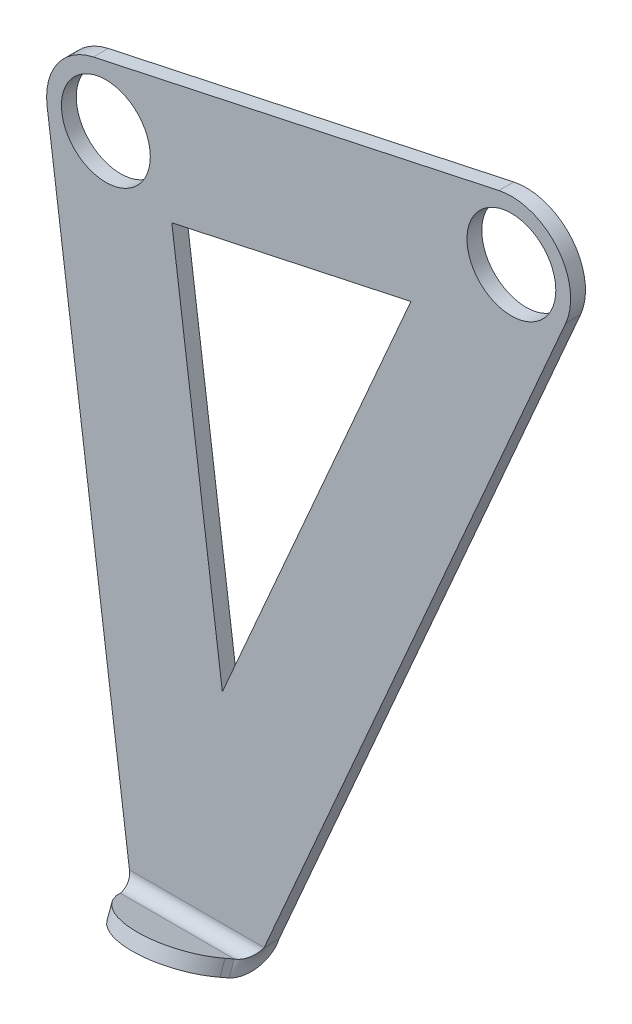
ISO-10303-21;
HEADER;
FILE_DESCRIPTION(('STEP AP214'),'2;1');
FILE_NAME('part.step','',(''),(''),'','','');
FILE_SCHEMA(('AUTOMOTIVE_DESIGN { 1 0 10303 214 1 1 1 1 }'));
ENDSEC;
DATA;
#1=APPLICATION_CONTEXT('core data for automotive mechanical design processes');
#2=APPLICATION_PROTOCOL_DEFINITION('international standard','automotive_design',2000,#1);
#3=PRODUCT_CONTEXT('',#1,'mechanical');
#4=PRODUCT('Part','Part','',(#3));
#5=PRODUCT_RELATED_PRODUCT_CATEGORY('part','',(#4));
#6=PRODUCT_DEFINITION_FORMATION('','',#4);
#7=PRODUCT_DEFINITION_CONTEXT('part definition',#1,'design');
#8=PRODUCT_DEFINITION('design','',#6,#7);
#9=PRODUCT_DEFINITION_SHAPE('','',#8);
#10=(LENGTH_UNIT() NAMED_UNIT(*) SI_UNIT(.MILLI.,.METRE.));
#11=(NAMED_UNIT(*) PLANE_ANGLE_UNIT() SI_UNIT($,.RADIAN.));
#12=(NAMED_UNIT(*) SI_UNIT($,.STERADIAN.) SOLID_ANGLE_UNIT());
#13=UNCERTAINTY_MEASURE_WITH_UNIT(LENGTH_MEASURE(1.E-05),#10,'distance_accuracy_value','');
#14=(GEOMETRIC_REPRESENTATION_CONTEXT(3) GLOBAL_UNCERTAINTY_ASSIGNED_CONTEXT((#13)) GLOBAL_UNIT_ASSIGNED_CONTEXT((#10,
#11,#12)) REPRESENTATION_CONTEXT('',''));
#15=CARTESIAN_POINT('',(0.,0.,0.));
#16=DIRECTION('',(0.,0.,1.));
#17=DIRECTION('',(1.,0.,0.));
#18=AXIS2_PLACEMENT_3D('',#15,#16,#17);
#19=CARTESIAN_POINT('',(-16.7495272777768,-26.7214691334636,-1.));
#20=DIRECTION('',(0.,0.,1.));
#21=DIRECTION('',(1.,0.,0.));
#22=AXIS2_PLACEMENT_3D('',#19,#20,#21);
#23=PLANE('',#22);
#24=CARTESIAN_POINT('',(10.6260753106475,-20.8413005201789,-1.));
#25=DIRECTION('',(0.,0.,1.));
#26=DIRECTION('',(1.,0.,0.));
#27=AXIS2_PLACEMENT_3D('',#24,#25,#26);
#28=CIRCLE('',#27,3.);
#29=CARTESIAN_POINT('',(13.6260753106475,-20.8413005201789,-1.));
#30=VERTEX_POINT('',#29);
#31=EDGE_CURVE('E368',#30,#30,#28,.T.);
#32=ORIENTED_EDGE('',*,*,#31,.T.);
#33=EDGE_LOOP('',(#32));
#34=FACE_BOUND('',#33,.T.);
#35=DIRECTION('',(-0.977700092443724,-0.210006021903025,0.));
#36=VECTOR('',#35,1.);
#37=CARTESIAN_POINT('',(-12.2983463233206,-29.8566076270304,-1.));
#38=LINE('',#37,#36);
#39=CARTESIAN_POINT('',(3.84254601269987,-26.3896092952819,-1.));
#40=VERTEX_POINT('',#39);
#41=CARTESIAN_POINT('',(-12.2983463233206,-29.8566076270304,-1.));
#42=VERTEX_POINT('',#41);
#43=EDGE_CURVE('E387',#40,#42,#38,.T.);
#44=ORIENTED_EDGE('',*,*,#43,.T.);
#45=DIRECTION('',(0.131568964918593,-0.991307019782595,0.));
#46=VECTOR('',#45,1.);
#47=CARTESIAN_POINT('',(-12.2983463233206,-29.8566076270304,-1.));
#48=LINE('',#47,#46);
#49=CARTESIAN_POINT('',(-8.88508147960652,-55.5738685482855,-1.));
#50=VERTEX_POINT('',#49);
#51=EDGE_CURVE('E380',#42,#50,#48,.T.);
#52=ORIENTED_EDGE('',*,*,#51,.T.);
#53=DIRECTION('',(0.39975126170382,0.916623657105905,0.));
#54=VECTOR('',#53,1.);
#55=CARTESIAN_POINT('',(-8.88508147960652,-55.5738685482855,-1.));
#56=LINE('',#55,#54);
#57=EDGE_CURVE('E383',#50,#40,#56,.T.);
#58=ORIENTED_EDGE('',*,*,#57,.T.);
#59=EDGE_LOOP('',(#44,#52,#58));
#60=FACE_BOUND('',#59,.T.);
#61=CARTESIAN_POINT('',(-16.7495272777768,-26.7214691334636,-1.));
#62=DIRECTION('',(0.,0.,1.));
#63=DIRECTION('',(1.,0.,0.));
#64=AXIS2_PLACEMENT_3D('',#61,#62,#63);
#65=CIRCLE('',#64,3.);
#66=CARTESIAN_POINT('',(-13.7495272777768,-26.7214691334636,-1.));
#67=VERTEX_POINT('',#66);
#68=EDGE_CURVE('E404',#67,#67,#65,.T.);
#69=ORIENTED_EDGE('',*,*,#68,.T.);
#70=EDGE_LOOP('',(#69));
#71=FACE_BOUND('',#70,.T.);
#72=DIRECTION('',(0.399751261703819,0.916623657105906,0.));
#73=VECTOR('',#72,1.);
#74=CARTESIAN_POINT('',(-7.29399819293511,-71.937983050713,-1.));
#75=LINE('',#74,#73);
#76=CARTESIAN_POINT('',(-6.06198184460126,-69.1129880125216,-1.));
#77=VERTEX_POINT('',#76);
#78=CARTESIAN_POINT('',(14.2925699390711,-22.4403055669941,-1.));
#79=VERTEX_POINT('',#78);
#80=EDGE_CURVE('E419',#77,#79,#75,.T.);
#81=ORIENTED_EDGE('',*,*,#80,.F.);
#82=DIRECTION('',(-1.,0.,0.));
#83=VECTOR('',#82,1.);
#84=CARTESIAN_POINT('',(-16.7495272777768,-69.1129880125216,-1.));
#85=LINE('',#84,#83);
#86=CARTESIAN_POINT('',(-15.1582863919909,-69.1129880125217,-1.));
#87=VERTEX_POINT('',#86);
#88=EDGE_CURVE('E431',#77,#87,#85,.T.);
#89=ORIENTED_EDGE('',*,*,#88,.T.);
#90=DIRECTION('',(0.131568964918592,-0.991307019782595,0.));
#91=VECTOR('',#90,1.);
#92=CARTESIAN_POINT('',(-20.7147553569072,-27.2477449931379,-1.));
#93=LINE('',#92,#91);
#94=CARTESIAN_POINT('',(-20.7147553569072,-27.2477449931379,-1.));
#95=VERTEX_POINT('',#94);
#96=EDGE_CURVE('E413',#95,#87,#93,.T.);
#97=ORIENTED_EDGE('',*,*,#96,.F.);
#98=CARTESIAN_POINT('',(-16.7495272777768,-26.7214691334636,-1.));
#99=DIRECTION('',(0.,0.,1.));
#100=DIRECTION('',(1.,0.,0.));
#101=AXIS2_PLACEMENT_3D('',#98,#99,#100);
#102=CIRCLE('',#101,4.);
#103=CARTESIAN_POINT('',(-17.5895513653889,-22.8106687636887,-1.));
#104=VERTEX_POINT('',#103);
#105=EDGE_CURVE('E410',#104,#95,#102,.T.);
#106=ORIENTED_EDGE('',*,*,#105,.F.);
#107=DIRECTION('',(-0.977700092443724,-0.210006021903025,0.));
#108=VECTOR('',#107,1.);
#109=CARTESIAN_POINT('',(-17.5895513653889,-22.8106687636887,-1.));
#110=LINE('',#109,#108);
#111=CARTESIAN_POINT('',(9.78605122303541,-16.930500150404,-1.));
#112=VERTEX_POINT('',#111);
#113=EDGE_CURVE('E418',#112,#104,#110,.T.);
#114=ORIENTED_EDGE('',*,*,#113,.F.);
#115=CARTESIAN_POINT('',(10.6260753106475,-20.8413005201789,-1.));
#116=DIRECTION('',(0.,0.,1.));
#117=DIRECTION('',(1.,0.,0.));
#118=AXIS2_PLACEMENT_3D('',#115,#116,#117);
#119=CIRCLE('',#118,4.);
#120=EDGE_CURVE('E415',#79,#112,#119,.T.);
#121=ORIENTED_EDGE('',*,*,#120,.F.);
#122=EDGE_LOOP('',(#81,#89,#97,#106,#114,#121));
#123=FACE_BOUND('',#122,.T.);
#124=ADVANCED_FACE('F66',(#34,#60,#71,#123),#23,.F.);
#125=CARTESIAN_POINT('',(-16.7495272777768,-26.7214691334636,-1.));
#126=DIRECTION('',(0.,0.,1.));
#127=DIRECTION('',(1.,0.,0.));
#128=AXIS2_PLACEMENT_3D('',#125,#126,#127);
#129=CYLINDRICAL_SURFACE('',#128,4.);
#130=CARTESIAN_POINT('',(-16.7495272777768,-26.7214691334636,0.));
#131=DIRECTION('',(0.,0.,1.));
#132=DIRECTION('',(1.,0.,0.));
#133=AXIS2_PLACEMENT_3D('',#130,#131,#132);
#134=CIRCLE('',#133,4.);
#135=CARTESIAN_POINT('',(-17.5895513653889,-22.8106687636887,0.));
#136=VERTEX_POINT('',#135);
#137=CARTESIAN_POINT('',(-20.7147553569072,-27.2477449931379,0.));
#138=VERTEX_POINT('',#137);
#139=EDGE_CURVE('E407',#136,#138,#134,.T.);
#140=ORIENTED_EDGE('',*,*,#139,.F.);
#141=DIRECTION('',(0.,0.,1.));
#142=VECTOR('',#141,1.);
#143=CARTESIAN_POINT('',(-17.5895513653889,-22.8106687636887,-1.));
#144=LINE('',#143,#142);
#145=EDGE_CURVE('E429',#104,#136,#144,.T.);
#146=ORIENTED_EDGE('',*,*,#145,.F.);
#147=ORIENTED_EDGE('',*,*,#105,.T.);
#148=DIRECTION('',(0.,0.,1.));
#149=VECTOR('',#148,1.);
#150=CARTESIAN_POINT('',(-20.7147553569072,-27.2477449931379,-1.));
#151=LINE('',#150,#149);
#152=EDGE_CURVE('E422',#95,#138,#151,.T.);
#153=ORIENTED_EDGE('',*,*,#152,.T.);
#154=EDGE_LOOP('',(#140,#146,#147,#153));
#155=FACE_BOUND('',#154,.T.);
#156=ADVANCED_FACE('F462',(#155),#129,.T.);
#157=CARTESIAN_POINT('',(-17.5895513653889,-22.8106687636887,-1.));
#158=DIRECTION('',(-0.210006021903025,0.977700092443724,0.));
#159=DIRECTION('',(-0.977700092443724,-0.210006021903025,0.));
#160=AXIS2_PLACEMENT_3D('',#157,#158,#159);
#161=PLANE('',#160);
#162=DIRECTION('',(-0.977700092443724,-0.210006021903025,0.));
#163=VECTOR('',#162,1.);
#164=CARTESIAN_POINT('',(-17.5895513653889,-22.8106687636887,0.));
#165=LINE('',#164,#163);
#166=CARTESIAN_POINT('',(9.78605122303541,-16.930500150404,0.));
#167=VERTEX_POINT('',#166);
#168=EDGE_CURVE('E414',#167,#136,#165,.T.);
#169=ORIENTED_EDGE('',*,*,#168,.F.);
#170=DIRECTION('',(0.,0.,1.));
#171=VECTOR('',#170,1.);
#172=CARTESIAN_POINT('',(9.78605122303541,-16.930500150404,-1.));
#173=LINE('',#172,#171);
#174=EDGE_CURVE('E432',#112,#167,#173,.T.);
#175=ORIENTED_EDGE('',*,*,#174,.F.);
#176=ORIENTED_EDGE('',*,*,#113,.T.);
#177=ORIENTED_EDGE('',*,*,#145,.T.);
#178=EDGE_LOOP('',(#169,#175,#176,#177));
#179=FACE_BOUND('',#178,.T.);
#180=ADVANCED_FACE('F494',(#179),#161,.T.);
#181=CARTESIAN_POINT('',(10.6260753106475,-20.8413005201789,-1.));
#182=DIRECTION('',(0.,0.,1.));
#183=DIRECTION('',(1.,0.,0.));
#184=AXIS2_PLACEMENT_3D('',#181,#182,#183);
#185=CYLINDRICAL_SURFACE('',#184,4.);
#186=CARTESIAN_POINT('',(10.6260753106475,-20.8413005201789,0.));
#187=DIRECTION('',(0.,0.,1.));
#188=DIRECTION('',(1.,0.,0.));
#189=AXIS2_PLACEMENT_3D('',#186,#187,#188);
#190=CIRCLE('',#189,4.);
#191=CARTESIAN_POINT('',(14.2925699390711,-22.4403055669941,0.));
#192=VERTEX_POINT('',#191);
#193=EDGE_CURVE('E424',#192,#167,#190,.T.);
#194=ORIENTED_EDGE('',*,*,#193,.F.);
#195=DIRECTION('',(0.,0.,1.));
#196=VECTOR('',#195,1.);
#197=CARTESIAN_POINT('',(14.2925699390711,-22.4403055669941,-1.));
#198=LINE('',#197,#196);
#199=EDGE_CURVE('E434',#79,#192,#198,.T.);
#200=ORIENTED_EDGE('',*,*,#199,.F.);
#201=ORIENTED_EDGE('',*,*,#120,.T.);
#202=ORIENTED_EDGE('',*,*,#174,.T.);
#203=EDGE_LOOP('',(#194,#200,#201,#202));
#204=FACE_BOUND('',#203,.T.);
#205=ADVANCED_FACE('F468',(#204),#185,.T.);
#206=CARTESIAN_POINT('',(-7.29399819293511,-71.937983050713,-1.));
#207=DIRECTION('',(0.916623657105906,-0.399751261703819,0.));
#208=DIRECTION('',(0.399751261703819,0.916623657105906,0.));
#209=AXIS2_PLACEMENT_3D('',#206,#207,#208);
#210=PLANE('',#209);
#211=CARTESIAN_POINT('',(-6.06198184460127,-69.1129880125217,-1.));
#212=CARTESIAN_POINT('',(-6.06198184460127,-69.1129880125216,0.));
#213=B_SPLINE_CURVE_WITH_KNOTS('',1,(#211,#212),.UNSPECIFIED.,.F.,.F.,(2,2),(0.,1.),.UNSPECIFIED.);
#214=CARTESIAN_POINT('',(-6.06198184460127,-69.1129880125217,0.));
#215=VERTEX_POINT('',#214);
#216=EDGE_CURVE('E354',#77,#215,#213,.T.);
#217=ORIENTED_EDGE('',*,*,#216,.F.);
#218=ORIENTED_EDGE('',*,*,#80,.T.);
#219=ORIENTED_EDGE('',*,*,#199,.T.);
#220=DIRECTION('',(0.399751261703819,0.916623657105906,0.));
#221=VECTOR('',#220,1.);
#222=CARTESIAN_POINT('',(-7.29399819293511,-71.937983050713,0.));
#223=LINE('',#222,#221);
#224=EDGE_CURVE('E92',#215,#192,#223,.T.);
#225=ORIENTED_EDGE('',*,*,#224,.F.);
#226=EDGE_LOOP('',(#217,#218,#219,#225));
#227=FACE_BOUND('',#226,.T.);
#228=ADVANCED_FACE('F461',(#227),#210,.T.);
#229=CARTESIAN_POINT('',(-20.7147553569072,-27.2477449931379,-1.));
#230=DIRECTION('',(-0.991307019782595,-0.131568964918592,0.));
#231=DIRECTION('',(0.131568964918592,-0.991307019782595,0.));
#232=AXIS2_PLACEMENT_3D('',#229,#230,#231);
#233=PLANE('',#232);
#234=CARTESIAN_POINT('',(-15.1582863919909,-69.1129880125216,0.));
#235=CARTESIAN_POINT('',(-15.1582863919909,-69.1129880125217,-1.));
#236=B_SPLINE_CURVE_WITH_KNOTS('',1,(#234,#235),.UNSPECIFIED.,.F.,.F.,(2,2),(0.,1.),.UNSPECIFIED.);
#237=CARTESIAN_POINT('',(-15.1582863919909,-69.1129880125217,0.));
#238=VERTEX_POINT('',#237);
#239=EDGE_CURVE('E12',#238,#87,#236,.T.);
#240=ORIENTED_EDGE('',*,*,#239,.F.);
#241=DIRECTION('',(0.131568964918592,-0.991307019782595,0.));
#242=VECTOR('',#241,1.);
#243=CARTESIAN_POINT('',(-20.7147553569072,-27.2477449931379,0.));
#244=LINE('',#243,#242);
#245=EDGE_CURVE('E84',#138,#238,#244,.T.);
#246=ORIENTED_EDGE('',*,*,#245,.F.);
#247=ORIENTED_EDGE('',*,*,#152,.F.);
#248=ORIENTED_EDGE('',*,*,#96,.T.);
#249=EDGE_LOOP('',(#240,#246,#247,#248));
#250=FACE_BOUND('',#249,.T.);
#251=ADVANCED_FACE('F451',(#250),#233,.T.);
#252=CARTESIAN_POINT('',(-16.7495272777768,-26.7214691334636,0.));
#253=DIRECTION('',(0.,0.,1.));
#254=DIRECTION('',(1.,0.,0.));
#255=AXIS2_PLACEMENT_3D('',#252,#253,#254);
#256=PLANE('',#255);
#257=DIRECTION('',(-1.,0.,0.));
#258=VECTOR('',#257,1.);
#259=CARTESIAN_POINT('',(-16.7495272777768,-69.1129880125217,0.));
#260=LINE('',#259,#258);
#261=EDGE_CURVE('E77',#215,#238,#260,.T.);
#262=ORIENTED_EDGE('',*,*,#261,.F.);
#263=ORIENTED_EDGE('',*,*,#224,.T.);
#264=ORIENTED_EDGE('',*,*,#193,.T.);
#265=ORIENTED_EDGE('',*,*,#168,.T.);
#266=ORIENTED_EDGE('',*,*,#139,.T.);
#267=ORIENTED_EDGE('',*,*,#245,.T.);
#268=EDGE_LOOP('',(#262,#263,#264,#265,#266,#267));
#269=FACE_BOUND('',#268,.T.);
#270=CARTESIAN_POINT('',(10.6260753106475,-20.8413005201789,0.));
#271=DIRECTION('',(0.,0.,1.));
#272=DIRECTION('',(1.,0.,0.));
#273=AXIS2_PLACEMENT_3D('',#270,#271,#272);
#274=CIRCLE('',#273,3.);
#275=CARTESIAN_POINT('',(13.6260753106475,-20.8413005201789,0.));
#276=VERTEX_POINT('',#275);
#277=EDGE_CURVE('E377',#276,#276,#274,.T.);
#278=ORIENTED_EDGE('',*,*,#277,.F.);
#279=EDGE_LOOP('',(#278));
#280=FACE_BOUND('',#279,.T.);
#281=DIRECTION('',(0.131568964918593,-0.991307019782595,0.));
#282=VECTOR('',#281,1.);
#283=CARTESIAN_POINT('',(-12.2983463233206,-29.8566076270304,0.));
#284=LINE('',#283,#282);
#285=CARTESIAN_POINT('',(-12.2983463233206,-29.8566076270304,0.));
#286=VERTEX_POINT('',#285);
#287=CARTESIAN_POINT('',(-8.88508147960652,-55.5738685482855,0.));
#288=VERTEX_POINT('',#287);
#289=EDGE_CURVE('E376',#286,#288,#284,.T.);
#290=ORIENTED_EDGE('',*,*,#289,.F.);
#291=DIRECTION('',(-0.977700092443724,-0.210006021903025,0.));
#292=VECTOR('',#291,1.);
#293=CARTESIAN_POINT('',(-12.2983463233206,-29.8566076270304,0.));
#294=LINE('',#293,#292);
#295=CARTESIAN_POINT('',(3.84254601269987,-26.3896092952819,0.));
#296=VERTEX_POINT('',#295);
#297=EDGE_CURVE('E384',#296,#286,#294,.T.);
#298=ORIENTED_EDGE('',*,*,#297,.F.);
#299=DIRECTION('',(0.39975126170382,0.916623657105905,0.));
#300=VECTOR('',#299,1.);
#301=CARTESIAN_POINT('',(-8.88508147960652,-55.5738685482855,0.));
#302=LINE('',#301,#300);
#303=EDGE_CURVE('E392',#288,#296,#302,.T.);
#304=ORIENTED_EDGE('',*,*,#303,.F.);
#305=EDGE_LOOP('',(#290,#298,#304));
#306=FACE_BOUND('',#305,.T.);
#307=CARTESIAN_POINT('',(-16.7495272777768,-26.7214691334636,0.));
#308=DIRECTION('',(0.,0.,1.));
#309=DIRECTION('',(1.,0.,0.));
#310=AXIS2_PLACEMENT_3D('',#307,#308,#309);
#311=CIRCLE('',#310,3.);
#312=CARTESIAN_POINT('',(-13.7495272777768,-26.7214691334636,0.));
#313=VERTEX_POINT('',#312);
#314=EDGE_CURVE('E399',#313,#313,#311,.T.);
#315=ORIENTED_EDGE('',*,*,#314,.F.);
#316=EDGE_LOOP('',(#315));
#317=FACE_BOUND('',#316,.T.);
#318=ADVANCED_FACE('F68',(#269,#280,#306,#317),#256,.T.);
#319=CARTESIAN_POINT('',(-16.7495272777768,-26.7214691334636,-1.));
#320=DIRECTION('',(0.,0.,1.));
#321=DIRECTION('',(1.,0.,0.));
#322=AXIS2_PLACEMENT_3D('',#319,#320,#321);
#323=CYLINDRICAL_SURFACE('',#322,3.);
#324=ORIENTED_EDGE('',*,*,#68,.F.);
#325=EDGE_LOOP('',(#324));
#326=FACE_BOUND('',#325,.T.);
#327=ORIENTED_EDGE('',*,*,#314,.T.);
#328=EDGE_LOOP('',(#327));
#329=FACE_BOUND('',#328,.T.);
#330=ADVANCED_FACE('F546',(#326,#329),#323,.F.);
#331=CARTESIAN_POINT('',(-12.2983463233206,-29.8566076270304,-1.));
#332=DIRECTION('',(-0.991307019782595,-0.131568964918593,0.));
#333=DIRECTION('',(0.131568964918593,-0.991307019782595,0.));
#334=AXIS2_PLACEMENT_3D('',#331,#332,#333);
#335=PLANE('',#334);
#336=ORIENTED_EDGE('',*,*,#289,.T.);
#337=DIRECTION('',(0.,0.,1.));
#338=VECTOR('',#337,1.);
#339=CARTESIAN_POINT('',(-8.88508147960652,-55.5738685482855,-1.));
#340=LINE('',#339,#338);
#341=EDGE_CURVE('E390',#50,#288,#340,.T.);
#342=ORIENTED_EDGE('',*,*,#341,.F.);
#343=ORIENTED_EDGE('',*,*,#51,.F.);
#344=DIRECTION('',(0.,0.,1.));
#345=VECTOR('',#344,1.);
#346=CARTESIAN_POINT('',(-12.2983463233206,-29.8566076270304,-1.));
#347=LINE('',#346,#345);
#348=EDGE_CURVE('E397',#42,#286,#347,.T.);
#349=ORIENTED_EDGE('',*,*,#348,.T.);
#350=EDGE_LOOP('',(#336,#342,#343,#349));
#351=FACE_BOUND('',#350,.T.);
#352=ADVANCED_FACE('F549',(#351),#335,.F.);
#353=CARTESIAN_POINT('',(-12.2983463233206,-29.8566076270304,-1.));
#354=DIRECTION('',(-0.210006021903025,0.977700092443724,0.));
#355=DIRECTION('',(-0.977700092443724,-0.210006021903025,0.));
#356=AXIS2_PLACEMENT_3D('',#353,#354,#355);
#357=PLANE('',#356);
#358=ORIENTED_EDGE('',*,*,#297,.T.);
#359=ORIENTED_EDGE('',*,*,#348,.F.);
#360=ORIENTED_EDGE('',*,*,#43,.F.);
#361=DIRECTION('',(0.,0.,1.));
#362=VECTOR('',#361,1.);
#363=CARTESIAN_POINT('',(3.84254601269987,-26.3896092952819,-1.));
#364=LINE('',#363,#362);
#365=EDGE_CURVE('E400',#40,#296,#364,.T.);
#366=ORIENTED_EDGE('',*,*,#365,.T.);
#367=EDGE_LOOP('',(#358,#359,#360,#366));
#368=FACE_BOUND('',#367,.T.);
#369=ADVANCED_FACE('F553',(#368),#357,.F.);
#370=CARTESIAN_POINT('',(-8.88508147960652,-55.5738685482855,-1.));
#371=DIRECTION('',(0.916623657105905,-0.39975126170382,0.));
#372=DIRECTION('',(0.39975126170382,0.916623657105905,0.));
#373=AXIS2_PLACEMENT_3D('',#370,#371,#372);
#374=PLANE('',#373);
#375=ORIENTED_EDGE('',*,*,#303,.T.);
#376=ORIENTED_EDGE('',*,*,#365,.F.);
#377=ORIENTED_EDGE('',*,*,#57,.F.);
#378=ORIENTED_EDGE('',*,*,#341,.T.);
#379=EDGE_LOOP('',(#375,#376,#377,#378));
#380=FACE_BOUND('',#379,.T.);
#381=ADVANCED_FACE('F555',(#380),#374,.F.);
#382=CARTESIAN_POINT('',(10.6260753106475,-20.8413005201789,-1.));
#383=DIRECTION('',(0.,0.,1.));
#384=DIRECTION('',(1.,0.,0.));
#385=AXIS2_PLACEMENT_3D('',#382,#383,#384);
#386=CYLINDRICAL_SURFACE('',#385,3.);
#387=ORIENTED_EDGE('',*,*,#31,.F.);
#388=EDGE_LOOP('',(#387));
#389=FACE_BOUND('',#388,.T.);
#390=ORIENTED_EDGE('',*,*,#277,.T.);
#391=EDGE_LOOP('',(#390));
#392=FACE_BOUND('',#391,.T.);
#393=ADVANCED_FACE('F558',(#389,#392),#386,.F.);
#394=CARTESIAN_POINT('',(-6.06198184460127,-69.1129880125217,-1.));
#395=CARTESIAN_POINT('',(-6.14829469671405,-69.3909255726487,-0.999999999999998));
#396=CARTESIAN_POINT('',(-6.23454450431277,-69.6684170638612,-0.93207342588152));
#397=CARTESIAN_POINT('',(-6.40710716402426,-70.16130424467,-0.675492599913075));
#398=CARTESIAN_POINT('',(-6.49338849388001,-70.3761672384646,-0.487062811587054));
#399=CARTESIAN_POINT('',(-6.66595115359151,-70.6948876668032,-0.0318828671474053));
#400=CARTESIAN_POINT('',(-6.75223248344726,-70.7984662764964,0.234469085811438));
#401=CARTESIAN_POINT('',(-6.92479514315876,-70.8709960410704,0.785387343369855));
#402=CARTESIAN_POINT('',(-7.01104495075747,-70.8399184619287,1.06937630660871));
#403=CARTESIAN_POINT('',(-7.09735780287026,-70.7448582177785,1.33055218089934));
#404=CARTESIAN_POINT('',(-6.06198184460127,-69.1129880125216,0.));
#405=CARTESIAN_POINT('',(-6.1482856754241,-69.2308662854927,0.));
#406=CARTESIAN_POINT('',(-6.23454450431277,-69.3485799964078,0.0288118821235025));
#407=CARTESIAN_POINT('',(-6.40710716402426,-69.5576440856533,0.137643758438346));
#408=CARTESIAN_POINT('',(-6.49338849388001,-69.6487808363323,0.217568543697439));
#409=CARTESIAN_POINT('',(-6.66595115359151,-69.7839699803575,0.410638650270194));
#410=CARTESIAN_POINT('',(-6.75223248344726,-69.8279041067539,0.523615068875218));
#411=CARTESIAN_POINT('',(-6.92479514315876,-69.8586684880652,0.757293744746191));
#412=CARTESIAN_POINT('',(-7.01105397204743,-69.8454823408091,0.877762694311819));
#413=CARTESIAN_POINT('',(-7.09735780287026,-69.8051655969925,0.98853203757368));
#414=B_SPLINE_SURFACE_WITH_KNOTS('',1,3,((#394,#395,#396,#397,#398,#399,#400,#401,#402,#403),
(#404,#405,#406,#407,#408,#409,#410,#411,#412,#413)),.UNSPECIFIED.,.F.,.F.,.F.,(2,2),(4,2,2,2,
4),(0.,1.),(0.,0.25,0.5,0.75,1.),.UNSPECIFIED.);
#415=CARTESIAN_POINT('',(-6.06198184460127,-69.1129880125216,0.));
#416=CARTESIAN_POINT('',(-6.1482856754241,-69.2308662854927,0.));
#417=CARTESIAN_POINT('',(-6.23454450431277,-69.3485799964078,0.0288118821235025));
#418=CARTESIAN_POINT('',(-6.40710716402426,-69.5576440856533,0.137643758438346));
#419=CARTESIAN_POINT('',(-6.49338849388001,-69.6487808363323,0.217568543697439));
#420=CARTESIAN_POINT('',(-6.66595115359151,-69.7839699803575,0.410638650270194));
#421=CARTESIAN_POINT('',(-6.75223248344726,-69.8279041067539,0.523615068875218));
#422=CARTESIAN_POINT('',(-6.92479514315876,-69.8586684880652,0.757293744746191));
#423=CARTESIAN_POINT('',(-7.01105397204743,-69.8454823408091,0.877762694311819));
#424=CARTESIAN_POINT('',(-7.09735780287026,-69.8051655969925,0.98853203757368));
#425=B_SPLINE_CURVE_WITH_KNOTS('',3,(#415,#416,#417,#418,#419,#420,#421,#422,#423,#424),
.UNSPECIFIED.,.F.,.F.,(4,2,2,2,4),(0.,0.25,0.5,0.75,1.),.UNSPECIFIED.);
#426=CARTESIAN_POINT('',(-7.09735780287026,-69.8051655969925,0.988532037573694));
#427=VERTEX_POINT('',#426);
#428=EDGE_CURVE('E184',#215,#427,#425,.T.);
#429=CARTESIAN_POINT('',(-7.09735780287026,-69.8051655969925,0.98853203757368));
#430=CARTESIAN_POINT('',(-7.09735780287026,-70.7448582177785,1.33055218089934));
#431=B_SPLINE_CURVE_WITH_KNOTS('',1,(#429,#430),.UNSPECIFIED.,.F.,.F.,(2,2),(0.,1.),.UNSPECIFIED.);
#432=CARTESIAN_POINT('',(-7.09735780287026,-70.7448582177784,1.33055218089936));
#433=VERTEX_POINT('',#432);
#434=EDGE_CURVE('E188',#433,#427,#431,.F.);
#435=CARTESIAN_POINT('',(-7.09735780287026,-70.7448582177785,1.33055218089934));
#436=CARTESIAN_POINT('',(-7.01104495075747,-70.8399184619287,1.06937630660871));
#437=CARTESIAN_POINT('',(-6.92479514315876,-70.8709960410704,0.785387343369855));
#438=CARTESIAN_POINT('',(-6.75223248344726,-70.7984662764964,0.234469085811438));
#439=CARTESIAN_POINT('',(-6.66595115359151,-70.6948876668032,-0.0318828671474053));
#440=CARTESIAN_POINT('',(-6.49338849388001,-70.3761672384646,-0.487062811587054));
#441=CARTESIAN_POINT('',(-6.40710716402426,-70.16130424467,-0.675492599913075));
#442=CARTESIAN_POINT('',(-6.23454450431277,-69.6684170638612,-0.93207342588152));
#443=CARTESIAN_POINT('',(-6.14829469671405,-69.3909255726487,-0.999999999999998));
#444=CARTESIAN_POINT('',(-6.06198184460127,-69.1129880125217,-1.));
#445=B_SPLINE_CURVE_WITH_KNOTS('',3,(#435,#436,#437,#438,#439,#440,#441,#442,#443,#444),
.UNSPECIFIED.,.F.,.F.,(4,2,2,2,4),(0.,0.25,0.5,0.75,1.),.UNSPECIFIED.);
#446=EDGE_CURVE('E518',#77,#433,#445,.F.);
#447=ORIENTED_EDGE('',*,*,#216,.T.);
#448=ORIENTED_EDGE('',*,*,#428,.T.);
#449=ORIENTED_EDGE('',*,*,#434,.F.);
#450=ORIENTED_EDGE('',*,*,#446,.F.);
#451=EDGE_LOOP('',(#447,#448,#449,#450));
#452=FACE_BOUND('',#451,.T.);
#453=ADVANCED_FACE('F289',(#452),#414,.T.);
#454=CARTESIAN_POINT('',(-14.7921817188154,-70.7448582177785,1.33055218089934));
#455=CARTESIAN_POINT('',(-14.8367564809642,-70.8445543308996,1.05663936129162));
#456=CARTESIAN_POINT('',(-14.8811461383403,-70.8737440958657,0.758625500764035));
#457=CARTESIAN_POINT('',(-14.9257209004891,-70.8290910798464,0.470574019467213));
#458=CARTESIAN_POINT('',(-14.7921817188154,-69.8051655969925,0.988532037573682));
#459=CARTESIAN_POINT('',(-14.8367521064491,-69.8474487652445,0.872359987578547));
#460=CARTESIAN_POINT('',(-14.8811505128554,-69.8598322501506,0.745930393234305));
#461=CARTESIAN_POINT('',(-14.9257209004891,-69.840893989368,0.623761846561989));
#462=B_SPLINE_SURFACE_WITH_KNOTS('',1,3,((#454,#455,#456,#457),(#458,#459,#460,#461)),
.UNSPECIFIED.,.F.,.F.,.F.,(2,2),(4,4),(0.,1.),(0.,1.),.UNSPECIFIED.);
#463=CARTESIAN_POINT('',(-14.7921817188154,-70.7448582177785,1.33055218089934));
#464=CARTESIAN_POINT('',(-14.7921817188154,-69.8051655969925,0.988532037573682));
#465=B_SPLINE_CURVE_WITH_KNOTS('',1,(#463,#464),.UNSPECIFIED.,.F.,.F.,(2,2),(0.,1.),.UNSPECIFIED.);
#466=CARTESIAN_POINT('',(-14.7921817188154,-69.8051655969925,0.988532037573694));
#467=VERTEX_POINT('',#466);
#468=CARTESIAN_POINT('',(-14.7921817188154,-70.7448582177785,1.33055218089934));
#469=VERTEX_POINT('',#468);
#470=EDGE_CURVE('E172',#467,#469,#465,.F.);
#471=CARTESIAN_POINT('',(-14.7921817188154,-69.8051655969925,0.988532037573682));
#472=CARTESIAN_POINT('',(-14.8367521064491,-69.8474487652445,0.872359987578547));
#473=CARTESIAN_POINT('',(-14.8811505128554,-69.8598322501506,0.745930393234305));
#474=CARTESIAN_POINT('',(-14.9257209004891,-69.840893989368,0.623761846561989));
#475=B_SPLINE_CURVE_WITH_KNOTS('',3,(#471,#472,#473,#474),.UNSPECIFIED.,.F.,.F.,(4,4),(0.,1.),.UNSPECIFIED.);
#476=CARTESIAN_POINT('',(-14.9257209004891,-69.840893989368,0.623761846561989));
#477=VERTEX_POINT('',#476);
#478=EDGE_CURVE('E263',#467,#477,#475,.T.);
#479=CARTESIAN_POINT('',(-14.9257209004891,-69.840893989368,0.623761846561989));
#480=CARTESIAN_POINT('',(-14.9257209004891,-70.8290910798464,0.470574019467213));
#481=B_SPLINE_CURVE_WITH_KNOTS('',1,(#479,#480),.UNSPECIFIED.,.F.,.F.,(2,2),(0.,1.),.UNSPECIFIED.);
#482=CARTESIAN_POINT('',(-14.9257209004891,-70.8290910798464,0.470574019467213));
#483=VERTEX_POINT('',#482);
#484=EDGE_CURVE('E322',#477,#483,#481,.T.);
#485=CARTESIAN_POINT('',(-14.9257209004891,-70.8290910798464,0.470574019467213));
#486=CARTESIAN_POINT('',(-14.8811461383403,-70.8737440958657,0.758625500764035));
#487=CARTESIAN_POINT('',(-14.8367564809642,-70.8445543308996,1.05663936129162));
#488=CARTESIAN_POINT('',(-14.7921817188154,-70.7448582177785,1.33055218089934));
#489=B_SPLINE_CURVE_WITH_KNOTS('',3,(#485,#486,#487,#488),.UNSPECIFIED.,.F.,.F.,(4,4),(0.,1.),.UNSPECIFIED.);
#490=EDGE_CURVE('E254',#469,#483,#489,.F.);
#491=ORIENTED_EDGE('',*,*,#470,.F.);
#492=ORIENTED_EDGE('',*,*,#478,.T.);
#493=ORIENTED_EDGE('',*,*,#484,.T.);
#494=ORIENTED_EDGE('',*,*,#490,.F.);
#495=EDGE_LOOP('',(#491,#492,#493,#494));
#496=FACE_BOUND('',#495,.T.);
#497=ADVANCED_FACE('F278',(#496),#462,.T.);
#498=CARTESIAN_POINT('',(-14.9257209004891,-70.8290910798464,0.470574019467213));
#499=CARTESIAN_POINT('',(-14.9451036553872,-70.7976740562662,0.267906406235115));
#500=CARTESIAN_POINT('',(-14.9644818157394,-70.730008682751,0.070961259273655));
#501=CARTESIAN_POINT('',(-15.0032427309897,-70.5304940463487,-0.287366515648097));
#502=CARTESIAN_POINT('',(-15.0226231886149,-70.3987005629951,-0.448631630804583));
#503=CARTESIAN_POINT('',(-15.0613841038652,-70.0872749497502,-0.715500459696427));
#504=CARTESIAN_POINT('',(-15.0807645614903,-69.9077240748167,-0.821034543913466));
#505=CARTESIAN_POINT('',(-15.1195254767406,-69.5230623965774,-0.963302873886062));
#506=CARTESIAN_POINT('',(-15.1389036370928,-69.3180762638278,-0.999999999999999));
#507=CARTESIAN_POINT('',(-15.1582863919909,-69.1129880125217,-1.));
#508=CARTESIAN_POINT('',(-14.9257209004891,-69.840893989368,0.623761846561989));
#509=CARTESIAN_POINT('',(-14.9451035662796,-69.8275681381758,0.537798309993751));
#510=CARTESIAN_POINT('',(-14.9644818157394,-69.7988669862006,0.4542612366584));
#511=CARTESIAN_POINT('',(-15.0032427309897,-69.7142404278833,0.302272155115522));
#512=CARTESIAN_POINT('',(-15.0226231886149,-69.6583386198456,0.233869596193334));
#513=CARTESIAN_POINT('',(-15.0613841038652,-69.5262436603176,0.120673938378217));
#514=CARTESIAN_POINT('',(-15.0807645614903,-69.4500849741055,0.0759103736918921));
#515=CARTESIAN_POINT('',(-15.1195254767406,-69.2869260473572,0.0155655321291755));
#516=CARTESIAN_POINT('',(-15.1389037262004,-69.199978287434,0.));
#517=CARTESIAN_POINT('',(-15.1582863919909,-69.1129880125216,0.));
#518=B_SPLINE_SURFACE_WITH_KNOTS('',1,3,((#498,#499,#500,#501,#502,#503,#504,#505,#506,#507),
(#508,#509,#510,#511,#512,#513,#514,#515,#516,#517)),.UNSPECIFIED.,.F.,.F.,.F.,(2,2),(4,2,2,2,
4),(0.,1.),(0.,0.25,0.5,0.75,1.),.UNSPECIFIED.);
#519=CARTESIAN_POINT('',(-14.9257209004891,-69.840893989368,0.623761846561989));
#520=CARTESIAN_POINT('',(-14.9451035662796,-69.8275681381758,0.537798309993751));
#521=CARTESIAN_POINT('',(-14.9644818157394,-69.7988669862006,0.4542612366584));
#522=CARTESIAN_POINT('',(-15.0032427309897,-69.7142404278833,0.302272155115522));
#523=CARTESIAN_POINT('',(-15.0226231886149,-69.6583386198456,0.233869596193334));
#524=CARTESIAN_POINT('',(-15.0613841038652,-69.5262436603176,0.120673938378217));
#525=CARTESIAN_POINT('',(-15.0807645614903,-69.4500849741055,0.0759103736918921));
#526=CARTESIAN_POINT('',(-15.1195254767406,-69.2869260473572,0.0155655321291755));
#527=CARTESIAN_POINT('',(-15.1389037262004,-69.199978287434,0.));
#528=CARTESIAN_POINT('',(-15.1582863919909,-69.1129880125216,0.));
#529=B_SPLINE_CURVE_WITH_KNOTS('',3,(#519,#520,#521,#522,#523,#524,#525,#526,#527,#528),
.UNSPECIFIED.,.F.,.F.,(4,2,2,2,4),(0.,0.25,0.5,0.75,1.),.UNSPECIFIED.);
#530=EDGE_CURVE('E504',#477,#238,#529,.T.);
#531=CARTESIAN_POINT('',(-15.1582863919909,-69.1129880125217,-1.));
#532=CARTESIAN_POINT('',(-15.1389036370928,-69.3180762638278,-0.999999999999999));
#533=CARTESIAN_POINT('',(-15.1195254767406,-69.5230623965774,-0.963302873886062));
#534=CARTESIAN_POINT('',(-15.0807645614903,-69.9077240748167,-0.821034543913466));
#535=CARTESIAN_POINT('',(-15.0613841038652,-70.0872749497502,-0.715500459696427));
#536=CARTESIAN_POINT('',(-15.0226231886149,-70.3987005629951,-0.448631630804583));
#537=CARTESIAN_POINT('',(-15.0032427309897,-70.5304940463487,-0.287366515648097));
#538=CARTESIAN_POINT('',(-14.9644818157394,-70.730008682751,0.070961259273655));
#539=CARTESIAN_POINT('',(-14.9451036553872,-70.7976740562662,0.267906406235115));
#540=CARTESIAN_POINT('',(-14.9257209004891,-70.8290910798464,0.470574019467213));
#541=B_SPLINE_CURVE_WITH_KNOTS('',3,(#531,#532,#533,#534,#535,#536,#537,#538,#539,#540),
.UNSPECIFIED.,.F.,.F.,(4,2,2,2,4),(0.,0.25,0.5,0.75,1.),.UNSPECIFIED.);
#542=EDGE_CURVE('E535',#483,#87,#541,.F.);
#543=ORIENTED_EDGE('',*,*,#484,.F.);
#544=ORIENTED_EDGE('',*,*,#530,.T.);
#545=ORIENTED_EDGE('',*,*,#239,.T.);
#546=ORIENTED_EDGE('',*,*,#542,.F.);
#547=EDGE_LOOP('',(#543,#544,#545,#546));
#548=FACE_BOUND('',#547,.T.);
#549=ADVANCED_FACE('F224',(#548),#518,.T.);
#550=CARTESIAN_POINT('',(-1.15608130082408,-69.1129880125216,0.7366));
#551=DIRECTION('',(-1.,0.,0.));
#552=DIRECTION('',(0.,0.,1.));
#553=AXIS2_PLACEMENT_3D('',#550,#551,#552);
#554=CYLINDRICAL_SURFACE('',#553,1.7366);
#555=ORIENTED_EDGE('',*,*,#542,.T.);
#556=ORIENTED_EDGE('',*,*,#88,.F.);
#557=ORIENTED_EDGE('',*,*,#446,.T.);
#558=DIRECTION('',(-1.,0.,0.));
#559=VECTOR('',#558,1.);
#560=CARTESIAN_POINT('',(-16.7495272777768,-70.7448582177784,1.33055218089936));
#561=LINE('',#560,#559);
#562=EDGE_CURVE('E187',#433,#469,#561,.T.);
#563=ORIENTED_EDGE('',*,*,#562,.T.);
#564=ORIENTED_EDGE('',*,*,#490,.T.);
#565=EDGE_LOOP('',(#555,#556,#557,#563,#564));
#566=FACE_BOUND('',#565,.T.);
#567=ADVANCED_FACE('F219',(#566),#554,.T.);
#568=CARTESIAN_POINT('',(-1.15608130082408,-69.1129880125216,0.7366));
#569=DIRECTION('',(-1.,0.,0.));
#570=DIRECTION('',(0.,0.,1.));
#571=AXIS2_PLACEMENT_3D('',#568,#569,#570);
#572=CYLINDRICAL_SURFACE('',#571,0.7366);
#573=ORIENTED_EDGE('',*,*,#530,.F.);
#574=ORIENTED_EDGE('',*,*,#478,.F.);
#575=DIRECTION('',(-1.,0.,0.));
#576=VECTOR('',#575,1.);
#577=CARTESIAN_POINT('',(-16.7495272777768,-69.8051655969925,0.988532037573694));
#578=LINE('',#577,#576);
#579=EDGE_CURVE('E202',#427,#467,#578,.T.);
#580=ORIENTED_EDGE('',*,*,#579,.F.);
#581=ORIENTED_EDGE('',*,*,#428,.F.);
#582=ORIENTED_EDGE('',*,*,#261,.T.);
#583=EDGE_LOOP('',(#573,#574,#580,#581,#582));
#584=FACE_BOUND('',#583,.T.);
#585=ADVANCED_FACE('F223',(#584),#572,.F.);
#586=CARTESIAN_POINT('',(-16.7495272777768,-86.0556021392526,-40.7353710184025));
#587=DIRECTION('',(0.,0.939692620785907,-0.342020143325672));
#588=DIRECTION('',(1.,0.,0.));
#589=AXIS2_PLACEMENT_3D('',#586,#587,#588);
#590=PLANE('',#589);
#591=ORIENTED_EDGE('',*,*,#562,.F.);
#592=DIRECTION('',(0.399751261703819,-0.313503754579064,-0.861344486620211));
#593=VECTOR('',#592,1.);
#594=CARTESIAN_POINT('',(-7.29399819293511,-70.5906435685877,1.75425344730011));
#595=LINE('',#594,#593);
#596=CARTESIAN_POINT('',(-7.29399819293511,-70.5906435685877,1.75425344730011));
#597=VERTEX_POINT('',#596);
#598=EDGE_CURVE('E181',#597,#433,#595,.T.);
#599=ORIENTED_EDGE('',*,*,#598,.F.);
#600=CARTESIAN_POINT('',(-10.9604928213587,-71.1375355038779,0.251680204208377));
#601=DIRECTION('',(0.,0.939692620785907,-0.342020143325672));
#602=DIRECTION('',(1.,0.,0.));
#603=AXIS2_PLACEMENT_3D('',#600,#601,#602);
#604=CIRCLE('',#603,4.);
#605=EDGE_CURVE('E166',#469,#597,#604,.T.);
#606=ORIENTED_EDGE('',*,*,#605,.F.);
#607=EDGE_LOOP('',(#591,#599,#606));
#608=FACE_BOUND('',#607,.T.);
#609=ADVANCED_FACE('F186',(#608),#590,.F.);
#610=CARTESIAN_POINT('',(-7.29399819293511,-70.5906435685877,1.75425344730011));
#611=DIRECTION('',(0.916623657105906,0.136722983822559,0.375643310772935));
#612=DIRECTION('',(0.399751261703819,-0.313503754579064,-0.861344486620211));
#613=AXIS2_PLACEMENT_3D('',#610,#611,#612);
#614=PLANE('',#613);
#615=ORIENTED_EDGE('',*,*,#598,.T.);
#616=ORIENTED_EDGE('',*,*,#434,.T.);
#617=DIRECTION('',(0.399751261703819,-0.313503754579064,-0.861344486620211));
#618=VECTOR('',#617,1.);
#619=CARTESIAN_POINT('',(-7.29399819293511,-69.6509509478017,1.41223330397444));
#620=LINE('',#619,#618);
#621=CARTESIAN_POINT('',(-7.29399819293511,-69.6509509478017,1.41223330397444));
#622=VERTEX_POINT('',#621);
#623=EDGE_CURVE('E183',#622,#427,#620,.T.);
#624=ORIENTED_EDGE('',*,*,#623,.F.);
#625=DIRECTION('',(0.,0.939692620785907,-0.342020143325672));
#626=VECTOR('',#625,1.);
#627=CARTESIAN_POINT('',(-7.29399819293511,-70.5906435685877,1.75425344730011));
#628=LINE('',#627,#626);
#629=EDGE_CURVE('E169',#597,#622,#628,.T.);
#630=ORIENTED_EDGE('',*,*,#629,.F.);
#631=EDGE_LOOP('',(#615,#616,#624,#630));
#632=FACE_BOUND('',#631,.T.);
#633=ADVANCED_FACE('F179',(#632),#614,.T.);
#634=CARTESIAN_POINT('',(-16.7495272777768,-85.1159095184667,-41.0773911617281));
#635=DIRECTION('',(0.,0.939692620785907,-0.342020143325672));
#636=DIRECTION('',(1.,0.,0.));
#637=AXIS2_PLACEMENT_3D('',#634,#635,#636);
#638=PLANE('',#637);
#639=ORIENTED_EDGE('',*,*,#623,.T.);
#640=ORIENTED_EDGE('',*,*,#579,.T.);
#641=CARTESIAN_POINT('',(-10.9604928213587,-70.197842883092,-0.0903399391172927));
#642=DIRECTION('',(0.,0.939692620785907,-0.342020143325672));
#643=DIRECTION('',(1.,0.,0.));
#644=AXIS2_PLACEMENT_3D('',#641,#642,#643);
#645=CIRCLE('',#644,4.);
#646=EDGE_CURVE('E812',#467,#622,#645,.T.);
#647=ORIENTED_EDGE('',*,*,#646,.T.);
#648=EDGE_LOOP('',(#639,#640,#647));
#649=FACE_BOUND('',#648,.T.);
#650=ADVANCED_FACE('F213',(#649),#638,.T.);
#651=CARTESIAN_POINT('',(-10.9604928213587,-71.1375355038779,0.251680204208377));
#652=DIRECTION('',(0.,0.939692620785907,-0.342020143325672));
#653=DIRECTION('',(1.,0.,0.));
#654=AXIS2_PLACEMENT_3D('',#651,#652,#653);
#655=CYLINDRICAL_SURFACE('',#654,4.);
#656=ORIENTED_EDGE('',*,*,#646,.F.);
#657=ORIENTED_EDGE('',*,*,#470,.T.);
#658=ORIENTED_EDGE('',*,*,#605,.T.);
#659=ORIENTED_EDGE('',*,*,#629,.T.);
#660=EDGE_LOOP('',(#656,#657,#658,#659));
#661=FACE_BOUND('',#660,.T.);
#662=ADVANCED_FACE('F168',(#661),#655,.T.);
#663=CLOSED_SHELL('',(#124,#156,#180,#205,#228,#251,#318,#330,#352,#369,#381,#393,#453,#497,
#549,#567,#585,#609,#633,#650,#662));
#664=MANIFOLD_SOLID_BREP('B2',#663);
#665=ADVANCED_BREP_SHAPE_REPRESENTATION('',(#18,#664),#14);
#666=SHAPE_DEFINITION_REPRESENTATION(#9,#665);
ENDSEC;
END-ISO-10303-21;
